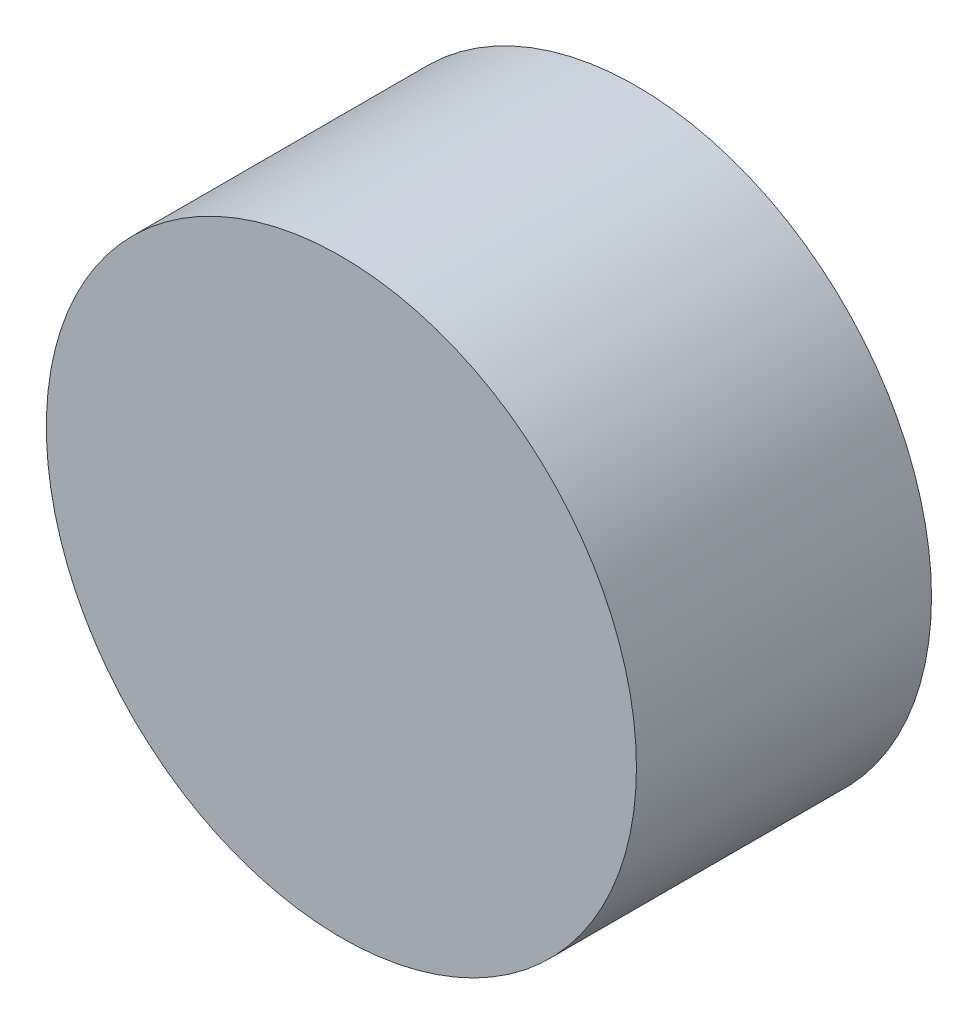
ISO-10303-21;
HEADER;
FILE_DESCRIPTION(('STEP AP214'),'2;1');
FILE_NAME('part.step','',(''),(''),'','','');
FILE_SCHEMA(('AUTOMOTIVE_DESIGN { 1 0 10303 214 1 1 1 1 }'));
ENDSEC;
DATA;
#1=APPLICATION_CONTEXT('core data for automotive mechanical design processes');
#2=APPLICATION_PROTOCOL_DEFINITION('international standard','automotive_design',2000,#1);
#3=PRODUCT_CONTEXT('',#1,'mechanical');
#4=PRODUCT('Part','Part','',(#3));
#5=PRODUCT_RELATED_PRODUCT_CATEGORY('part','',(#4));
#6=PRODUCT_DEFINITION_FORMATION('','',#4);
#7=PRODUCT_DEFINITION_CONTEXT('part definition',#1,'design');
#8=PRODUCT_DEFINITION('design','',#6,#7);
#9=PRODUCT_DEFINITION_SHAPE('','',#8);
#10=(LENGTH_UNIT() NAMED_UNIT(*) SI_UNIT(.MILLI.,.METRE.));
#11=(NAMED_UNIT(*) PLANE_ANGLE_UNIT() SI_UNIT($,.RADIAN.));
#12=(NAMED_UNIT(*) SI_UNIT($,.STERADIAN.) SOLID_ANGLE_UNIT());
#13=UNCERTAINTY_MEASURE_WITH_UNIT(LENGTH_MEASURE(1.E-05),#10,'distance_accuracy_value','');
#14=(GEOMETRIC_REPRESENTATION_CONTEXT(3) GLOBAL_UNCERTAINTY_ASSIGNED_CONTEXT((#13)) GLOBAL_UNIT_ASSIGNED_CONTEXT((#10,
#11,#12)) REPRESENTATION_CONTEXT('',''));
#15=CARTESIAN_POINT('',(0.,0.,0.));
#16=DIRECTION('',(0.,0.,1.));
#17=DIRECTION('',(1.,0.,0.));
#18=AXIS2_PLACEMENT_3D('',#15,#16,#17);
#19=CARTESIAN_POINT('',(-8.41208972314894,9.41352897590476,4.));
#20=DIRECTION('',(0.,0.,-1.));
#21=DIRECTION('',(-1.,0.,0.));
#22=AXIS2_PLACEMENT_3D('',#19,#20,#21);
#23=CYLINDRICAL_SURFACE('',#22,4.);
#24=CARTESIAN_POINT('',(-8.41208972314894,9.41352897590476,4.));
#25=DIRECTION('',(0.,0.,1.));
#26=DIRECTION('',(1.,0.,0.));
#27=AXIS2_PLACEMENT_3D('',#24,#25,#26);
#28=CIRCLE('',#27,4.);
#29=CARTESIAN_POINT('',(-4.41208972314894,9.41352897590476,4.));
#30=VERTEX_POINT('',#29);
#31=EDGE_CURVE('E10',#30,#30,#28,.T.);
#32=ORIENTED_EDGE('',*,*,#31,.F.);
#33=EDGE_LOOP('',(#32));
#34=FACE_BOUND('',#33,.T.);
#35=CARTESIAN_POINT('',(-8.41208972314894,9.41352897590476,0.));
#36=DIRECTION('',(0.,0.,1.));
#37=DIRECTION('',(1.,0.,0.));
#38=AXIS2_PLACEMENT_3D('',#35,#36,#37);
#39=CIRCLE('',#38,4.);
#40=CARTESIAN_POINT('',(-4.41208972314894,9.41352897590476,0.));
#41=VERTEX_POINT('',#40);
#42=EDGE_CURVE('E40',#41,#41,#39,.T.);
#43=ORIENTED_EDGE('',*,*,#42,.T.);
#44=EDGE_LOOP('',(#43));
#45=FACE_BOUND('',#44,.T.);
#46=ADVANCED_FACE('F37',(#34,#45),#23,.T.);
#47=CARTESIAN_POINT('',(-8.41208972314894,9.41352897590476,4.));
#48=DIRECTION('',(0.,0.,1.));
#49=DIRECTION('',(1.,0.,0.));
#50=AXIS2_PLACEMENT_3D('',#47,#48,#49);
#51=PLANE('',#50);
#52=ORIENTED_EDGE('',*,*,#31,.T.);
#53=EDGE_LOOP('',(#52));
#54=FACE_BOUND('',#53,.T.);
#55=ADVANCED_FACE('F54',(#54),#51,.T.);
#56=CARTESIAN_POINT('',(-8.41208972314894,9.41352897590476,0.));
#57=DIRECTION('',(0.,0.,1.));
#58=DIRECTION('',(1.,0.,0.));
#59=AXIS2_PLACEMENT_3D('',#56,#57,#58);
#60=PLANE('',#59);
#61=ORIENTED_EDGE('',*,*,#42,.F.);
#62=EDGE_LOOP('',(#61));
#63=FACE_BOUND('',#62,.T.);
#64=ADVANCED_FACE('F52',(#63),#60,.F.);
#65=CLOSED_SHELL('',(#46,#55,#64));
#66=MANIFOLD_SOLID_BREP('B2',#65);
#67=ADVANCED_BREP_SHAPE_REPRESENTATION('',(#18,#66),#14);
#68=SHAPE_DEFINITION_REPRESENTATION(#9,#67);
ENDSEC;
END-ISO-10303-21;
